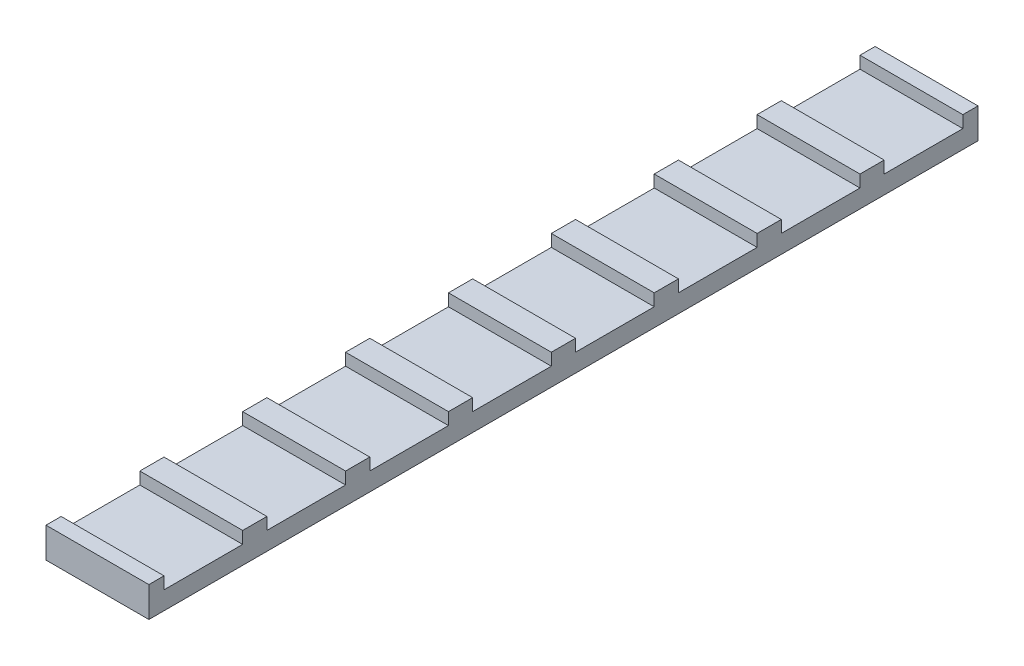
ISO-10303-21;
HEADER;
FILE_DESCRIPTION(('STEP AP214'),'2;1');
FILE_NAME('part.step','',(''),(''),'','','');
FILE_SCHEMA(('AUTOMOTIVE_DESIGN { 1 0 10303 214 1 1 1 1 }'));
ENDSEC;
DATA;
#1=APPLICATION_CONTEXT('core data for automotive mechanical design processes');
#2=APPLICATION_PROTOCOL_DEFINITION('international standard','automotive_design',2000,#1);
#3=PRODUCT_CONTEXT('',#1,'mechanical');
#4=PRODUCT('Part','Part','',(#3));
#5=PRODUCT_RELATED_PRODUCT_CATEGORY('part','',(#4));
#6=PRODUCT_DEFINITION_FORMATION('','',#4);
#7=PRODUCT_DEFINITION_CONTEXT('part definition',#1,'design');
#8=PRODUCT_DEFINITION('design','',#6,#7);
#9=PRODUCT_DEFINITION_SHAPE('','',#8);
#10=(LENGTH_UNIT() NAMED_UNIT(*) SI_UNIT(.MILLI.,.METRE.));
#11=(NAMED_UNIT(*) PLANE_ANGLE_UNIT() SI_UNIT($,.RADIAN.));
#12=(NAMED_UNIT(*) SI_UNIT($,.STERADIAN.) SOLID_ANGLE_UNIT());
#13=UNCERTAINTY_MEASURE_WITH_UNIT(LENGTH_MEASURE(1.E-05),#10,'distance_accuracy_value','');
#14=(GEOMETRIC_REPRESENTATION_CONTEXT(3) GLOBAL_UNCERTAINTY_ASSIGNED_CONTEXT((#13)) GLOBAL_UNIT_ASSIGNED_CONTEXT((#10,
#11,#12)) REPRESENTATION_CONTEXT('',''));
#15=CARTESIAN_POINT('',(0.,0.,0.));
#16=DIRECTION('',(0.,0.,1.));
#17=DIRECTION('',(1.,0.,0.));
#18=AXIS2_PLACEMENT_3D('',#15,#16,#17);
#19=CARTESIAN_POINT('',(0.,5.,0.));
#20=DIRECTION('',(0.,-1.,0.));
#21=DIRECTION('',(0.,0.,-1.));
#22=AXIS2_PLACEMENT_3D('',#19,#20,#21);
#23=PLANE('',#22);
#24=DIRECTION('',(0.,0.,1.));
#25=VECTOR('',#24,1.);
#26=CARTESIAN_POINT('',(-8.5,5.,68.5));
#27=LINE('',#26,#25);
#28=CARTESIAN_POINT('',(-8.5,5.,-53.));
#29=VERTEX_POINT('',#28);
#30=CARTESIAN_POINT('',(-8.5,5.,-49.));
#31=VERTEX_POINT('',#30);
#32=EDGE_CURVE('E572',#29,#31,#27,.T.);
#33=ORIENTED_EDGE('',*,*,#32,.T.);
#34=DIRECTION('',(-1.,0.,0.));
#35=VECTOR('',#34,1.);
#36=CARTESIAN_POINT('',(-8.5,5.,-49.));
#37=LINE('',#36,#35);
#38=CARTESIAN_POINT('',(8.5,5.,-49.));
#39=VERTEX_POINT('',#38);
#40=EDGE_CURVE('E294',#39,#31,#37,.T.);
#41=ORIENTED_EDGE('',*,*,#40,.F.);
#42=DIRECTION('',(0.,0.,-1.));
#43=VECTOR('',#42,1.);
#44=CARTESIAN_POINT('',(8.5,5.,68.5));
#45=LINE('',#44,#43);
#46=CARTESIAN_POINT('',(8.5,5.,-53.));
#47=VERTEX_POINT('',#46);
#48=EDGE_CURVE('E562',#39,#47,#45,.T.);
#49=ORIENTED_EDGE('',*,*,#48,.T.);
#50=DIRECTION('',(1.,0.,0.));
#51=VECTOR('',#50,1.);
#52=CARTESIAN_POINT('',(-8.49999999999999,5.,-53.));
#53=LINE('',#52,#51);
#54=EDGE_CURVE('E535',#29,#47,#53,.T.);
#55=ORIENTED_EDGE('',*,*,#54,.F.);
#56=EDGE_LOOP('',(#33,#41,#49,#55));
#57=FACE_BOUND('',#56,.T.);
#58=ADVANCED_FACE('F39',(#57),#23,.F.);
#59=CARTESIAN_POINT('',(8.5,5.,-32.));
#60=VERTEX_POINT('',#59);
#61=CARTESIAN_POINT('',(8.5,5.,-36.));
#62=VERTEX_POINT('',#61);
#63=EDGE_CURVE('E678',#60,#62,#45,.T.);
#64=ORIENTED_EDGE('',*,*,#63,.T.);
#65=DIRECTION('',(1.,0.,0.));
#66=VECTOR('',#65,1.);
#67=CARTESIAN_POINT('',(-8.49999999999999,5.,-36.));
#68=LINE('',#67,#66);
#69=CARTESIAN_POINT('',(-8.5,5.,-36.));
#70=VERTEX_POINT('',#69);
#71=EDGE_CURVE('E336',#70,#62,#68,.T.);
#72=ORIENTED_EDGE('',*,*,#71,.F.);
#73=CARTESIAN_POINT('',(-8.5,5.,-32.));
#74=VERTEX_POINT('',#73);
#75=EDGE_CURVE('E300',#70,#74,#27,.T.);
#76=ORIENTED_EDGE('',*,*,#75,.T.);
#77=DIRECTION('',(-1.,0.,0.));
#78=VECTOR('',#77,1.);
#79=CARTESIAN_POINT('',(-8.5,5.,-32.));
#80=LINE('',#79,#78);
#81=EDGE_CURVE('E315',#60,#74,#80,.T.);
#82=ORIENTED_EDGE('',*,*,#81,.F.);
#83=EDGE_LOOP('',(#64,#72,#76,#82));
#84=FACE_BOUND('',#83,.T.);
#85=ADVANCED_FACE('F779',(#84),#23,.F.);
#86=CARTESIAN_POINT('',(8.5,5.,-15.));
#87=VERTEX_POINT('',#86);
#88=CARTESIAN_POINT('',(8.5,5.,-19.));
#89=VERTEX_POINT('',#88);
#90=EDGE_CURVE('E682',#87,#89,#45,.T.);
#91=ORIENTED_EDGE('',*,*,#90,.T.);
#92=DIRECTION('',(1.,0.,0.));
#93=VECTOR('',#92,1.);
#94=CARTESIAN_POINT('',(-8.49999999999999,5.,-19.));
#95=LINE('',#94,#93);
#96=CARTESIAN_POINT('',(-8.5,5.,-19.));
#97=VERTEX_POINT('',#96);
#98=EDGE_CURVE('E327',#97,#89,#95,.T.);
#99=ORIENTED_EDGE('',*,*,#98,.F.);
#100=CARTESIAN_POINT('',(-8.5,5.,-15.));
#101=VERTEX_POINT('',#100);
#102=EDGE_CURVE('E642',#97,#101,#27,.T.);
#103=ORIENTED_EDGE('',*,*,#102,.T.);
#104=DIRECTION('',(-1.,0.,0.));
#105=VECTOR('',#104,1.);
#106=CARTESIAN_POINT('',(-8.5,5.,-15.));
#107=LINE('',#106,#105);
#108=EDGE_CURVE('E351',#87,#101,#107,.T.);
#109=ORIENTED_EDGE('',*,*,#108,.F.);
#110=EDGE_LOOP('',(#91,#99,#103,#109));
#111=FACE_BOUND('',#110,.T.);
#112=ADVANCED_FACE('F704',(#111),#23,.F.);
#113=CARTESIAN_POINT('',(8.5,5.,2.00000000000002));
#114=VERTEX_POINT('',#113);
#115=CARTESIAN_POINT('',(8.5,5.,-1.99999999999999));
#116=VERTEX_POINT('',#115);
#117=EDGE_CURVE('E696',#114,#116,#45,.T.);
#118=ORIENTED_EDGE('',*,*,#117,.T.);
#119=DIRECTION('',(1.,0.,0.));
#120=VECTOR('',#119,1.);
#121=CARTESIAN_POINT('',(-8.49999999999999,5.,-1.99999999999999));
#122=LINE('',#121,#120);
#123=CARTESIAN_POINT('',(-8.5,5.,-1.99999999999999));
#124=VERTEX_POINT('',#123);
#125=EDGE_CURVE('E363',#124,#116,#122,.T.);
#126=ORIENTED_EDGE('',*,*,#125,.F.);
#127=CARTESIAN_POINT('',(-8.5,5.,2.00000000000002));
#128=VERTEX_POINT('',#127);
#129=EDGE_CURVE('E635',#124,#128,#27,.T.);
#130=ORIENTED_EDGE('',*,*,#129,.T.);
#131=DIRECTION('',(-1.,0.,0.));
#132=VECTOR('',#131,1.);
#133=CARTESIAN_POINT('',(-8.5,5.,2.00000000000002));
#134=LINE('',#133,#132);
#135=EDGE_CURVE('E386',#114,#128,#134,.T.);
#136=ORIENTED_EDGE('',*,*,#135,.F.);
#137=EDGE_LOOP('',(#118,#126,#130,#136));
#138=FACE_BOUND('',#137,.T.);
#139=ADVANCED_FACE('F726',(#138),#23,.F.);
#140=CARTESIAN_POINT('',(8.5,5.,19.));
#141=VERTEX_POINT('',#140);
#142=CARTESIAN_POINT('',(8.5,5.,15.));
#143=VERTEX_POINT('',#142);
#144=EDGE_CURVE('E692',#141,#143,#45,.T.);
#145=ORIENTED_EDGE('',*,*,#144,.T.);
#146=DIRECTION('',(1.,0.,0.));
#147=VECTOR('',#146,1.);
#148=CARTESIAN_POINT('',(-8.49999999999999,5.,15.));
#149=LINE('',#148,#147);
#150=CARTESIAN_POINT('',(-8.5,5.,15.));
#151=VERTEX_POINT('',#150);
#152=EDGE_CURVE('E398',#151,#143,#149,.T.);
#153=ORIENTED_EDGE('',*,*,#152,.F.);
#154=CARTESIAN_POINT('',(-8.5,5.,19.));
#155=VERTEX_POINT('',#154);
#156=EDGE_CURVE('E628',#151,#155,#27,.T.);
#157=ORIENTED_EDGE('',*,*,#156,.T.);
#158=DIRECTION('',(-1.,0.,0.));
#159=VECTOR('',#158,1.);
#160=CARTESIAN_POINT('',(-8.5,5.,19.));
#161=LINE('',#160,#159);
#162=EDGE_CURVE('E421',#141,#155,#161,.T.);
#163=ORIENTED_EDGE('',*,*,#162,.F.);
#164=EDGE_LOOP('',(#145,#153,#157,#163));
#165=FACE_BOUND('',#164,.T.);
#166=ADVANCED_FACE('F738',(#165),#23,.F.);
#167=CARTESIAN_POINT('',(8.5,5.,36.));
#168=VERTEX_POINT('',#167);
#169=CARTESIAN_POINT('',(8.5,5.,32.));
#170=VERTEX_POINT('',#169);
#171=EDGE_CURVE('E688',#168,#170,#45,.T.);
#172=ORIENTED_EDGE('',*,*,#171,.T.);
#173=DIRECTION('',(1.,0.,0.));
#174=VECTOR('',#173,1.);
#175=CARTESIAN_POINT('',(-8.49999999999999,5.,32.));
#176=LINE('',#175,#174);
#177=CARTESIAN_POINT('',(-8.5,5.,32.));
#178=VERTEX_POINT('',#177);
#179=EDGE_CURVE('E433',#178,#170,#176,.T.);
#180=ORIENTED_EDGE('',*,*,#179,.F.);
#181=CARTESIAN_POINT('',(-8.5,5.,36.));
#182=VERTEX_POINT('',#181);
#183=EDGE_CURVE('E622',#178,#182,#27,.T.);
#184=ORIENTED_EDGE('',*,*,#183,.T.);
#185=DIRECTION('',(-1.,0.,0.));
#186=VECTOR('',#185,1.);
#187=CARTESIAN_POINT('',(-8.5,5.,36.));
#188=LINE('',#187,#186);
#189=EDGE_CURVE('E456',#168,#182,#188,.T.);
#190=ORIENTED_EDGE('',*,*,#189,.F.);
#191=EDGE_LOOP('',(#172,#180,#184,#190));
#192=FACE_BOUND('',#191,.T.);
#193=ADVANCED_FACE('F750',(#192),#23,.F.);
#194=CARTESIAN_POINT('',(8.5,5.,53.));
#195=VERTEX_POINT('',#194);
#196=CARTESIAN_POINT('',(8.5,5.,49.));
#197=VERTEX_POINT('',#196);
#198=EDGE_CURVE('E561',#195,#197,#45,.T.);
#199=ORIENTED_EDGE('',*,*,#198,.T.);
#200=DIRECTION('',(1.,0.,0.));
#201=VECTOR('',#200,1.);
#202=CARTESIAN_POINT('',(-8.49999999999999,5.,49.));
#203=LINE('',#202,#201);
#204=CARTESIAN_POINT('',(-8.5,5.,49.));
#205=VERTEX_POINT('',#204);
#206=EDGE_CURVE('E467',#205,#197,#203,.T.);
#207=ORIENTED_EDGE('',*,*,#206,.F.);
#208=CARTESIAN_POINT('',(-8.5,5.,53.));
#209=VERTEX_POINT('',#208);
#210=EDGE_CURVE('E619',#205,#209,#27,.T.);
#211=ORIENTED_EDGE('',*,*,#210,.T.);
#212=DIRECTION('',(-1.,0.,0.));
#213=VECTOR('',#212,1.);
#214=CARTESIAN_POINT('',(-8.5,5.,53.));
#215=LINE('',#214,#213);
#216=EDGE_CURVE('E490',#195,#209,#215,.T.);
#217=ORIENTED_EDGE('',*,*,#216,.F.);
#218=EDGE_LOOP('',(#199,#207,#211,#217));
#219=FACE_BOUND('',#218,.T.);
#220=ADVANCED_FACE('F760',(#219),#23,.F.);
#221=CARTESIAN_POINT('',(-8.5,5.,-68.5));
#222=VERTEX_POINT('',#221);
#223=CARTESIAN_POINT('',(-8.5,5.,-66.));
#224=VERTEX_POINT('',#223);
#225=EDGE_CURVE('E567',#222,#224,#27,.T.);
#226=ORIENTED_EDGE('',*,*,#225,.T.);
#227=DIRECTION('',(-1.,0.,0.));
#228=VECTOR('',#227,1.);
#229=CARTESIAN_POINT('',(-8.5,5.,-66.));
#230=LINE('',#229,#228);
#231=CARTESIAN_POINT('',(8.5,5.,-66.));
#232=VERTEX_POINT('',#231);
#233=EDGE_CURVE('E523',#232,#224,#230,.T.);
#234=ORIENTED_EDGE('',*,*,#233,.F.);
#235=CARTESIAN_POINT('',(8.5,5.,-68.5));
#236=VERTEX_POINT('',#235);
#237=EDGE_CURVE('E563',#232,#236,#45,.T.);
#238=ORIENTED_EDGE('',*,*,#237,.T.);
#239=DIRECTION('',(-1.,0.,0.));
#240=VECTOR('',#239,1.);
#241=CARTESIAN_POINT('',(-8.5,5.,-68.5));
#242=LINE('',#241,#240);
#243=EDGE_CURVE('E560',#236,#222,#242,.T.);
#244=ORIENTED_EDGE('',*,*,#243,.T.);
#245=EDGE_LOOP('',(#226,#234,#238,#244));
#246=FACE_BOUND('',#245,.T.);
#247=ADVANCED_FACE('F787',(#246),#23,.F.);
#248=CARTESIAN_POINT('',(8.5,5.,68.5));
#249=DIRECTION('',(-1.,0.,0.));
#250=DIRECTION('',(0.,0.,1.));
#251=AXIS2_PLACEMENT_3D('',#248,#249,#250);
#252=PLANE('',#251);
#253=ORIENTED_EDGE('',*,*,#48,.F.);
#254=DIRECTION('',(0.,1.,0.));
#255=VECTOR('',#254,1.);
#256=CARTESIAN_POINT('',(8.5,3.,-49.));
#257=LINE('',#256,#255);
#258=CARTESIAN_POINT('',(8.5,3.,-49.));
#259=VERTEX_POINT('',#258);
#260=EDGE_CURVE('E305',#259,#39,#257,.T.);
#261=ORIENTED_EDGE('',*,*,#260,.F.);
#262=DIRECTION('',(0.,0.,-1.));
#263=VECTOR('',#262,1.);
#264=CARTESIAN_POINT('',(8.5,3.,-49.));
#265=LINE('',#264,#263);
#266=CARTESIAN_POINT('',(8.5,3.,-36.));
#267=VERTEX_POINT('',#266);
#268=EDGE_CURVE('E283',#267,#259,#265,.T.);
#269=ORIENTED_EDGE('',*,*,#268,.F.);
#270=DIRECTION('',(0.,1.,0.));
#271=VECTOR('',#270,1.);
#272=CARTESIAN_POINT('',(8.5,3.,-36.));
#273=LINE('',#272,#271);
#274=EDGE_CURVE('E279',#267,#62,#273,.T.);
#275=ORIENTED_EDGE('',*,*,#274,.T.);
#276=ORIENTED_EDGE('',*,*,#63,.F.);
#277=DIRECTION('',(0.,1.,0.));
#278=VECTOR('',#277,1.);
#279=CARTESIAN_POINT('',(8.5,3.,-32.));
#280=LINE('',#279,#278);
#281=CARTESIAN_POINT('',(8.5,3.,-32.));
#282=VERTEX_POINT('',#281);
#283=EDGE_CURVE('E337',#282,#60,#280,.T.);
#284=ORIENTED_EDGE('',*,*,#283,.F.);
#285=DIRECTION('',(0.,0.,-1.));
#286=VECTOR('',#285,1.);
#287=CARTESIAN_POINT('',(8.5,3.,-32.));
#288=LINE('',#287,#286);
#289=CARTESIAN_POINT('',(8.5,3.,-19.));
#290=VERTEX_POINT('',#289);
#291=EDGE_CURVE('E319',#290,#282,#288,.T.);
#292=ORIENTED_EDGE('',*,*,#291,.F.);
#293=DIRECTION('',(0.,1.,0.));
#294=VECTOR('',#293,1.);
#295=CARTESIAN_POINT('',(8.5,3.,-19.));
#296=LINE('',#295,#294);
#297=EDGE_CURVE('E340',#290,#89,#296,.T.);
#298=ORIENTED_EDGE('',*,*,#297,.T.);
#299=ORIENTED_EDGE('',*,*,#90,.F.);
#300=DIRECTION('',(0.,1.,0.));
#301=VECTOR('',#300,1.);
#302=CARTESIAN_POINT('',(8.5,3.,-15.));
#303=LINE('',#302,#301);
#304=CARTESIAN_POINT('',(8.5,3.,-15.));
#305=VERTEX_POINT('',#304);
#306=EDGE_CURVE('E372',#305,#87,#303,.T.);
#307=ORIENTED_EDGE('',*,*,#306,.F.);
#308=DIRECTION('',(0.,0.,-1.));
#309=VECTOR('',#308,1.);
#310=CARTESIAN_POINT('',(8.5,3.,-15.));
#311=LINE('',#310,#309);
#312=CARTESIAN_POINT('',(8.5,3.,-1.99999999999999));
#313=VERTEX_POINT('',#312);
#314=EDGE_CURVE('E355',#313,#305,#311,.T.);
#315=ORIENTED_EDGE('',*,*,#314,.F.);
#316=DIRECTION('',(0.,1.,0.));
#317=VECTOR('',#316,1.);
#318=CARTESIAN_POINT('',(8.5,3.,-1.99999999999999));
#319=LINE('',#318,#317);
#320=EDGE_CURVE('E375',#313,#116,#319,.T.);
#321=ORIENTED_EDGE('',*,*,#320,.T.);
#322=ORIENTED_EDGE('',*,*,#117,.F.);
#323=DIRECTION('',(0.,1.,0.));
#324=VECTOR('',#323,1.);
#325=CARTESIAN_POINT('',(8.5,3.,2.00000000000002));
#326=LINE('',#325,#324);
#327=CARTESIAN_POINT('',(8.5,3.,2.00000000000002));
#328=VERTEX_POINT('',#327);
#329=EDGE_CURVE('E407',#328,#114,#326,.T.);
#330=ORIENTED_EDGE('',*,*,#329,.F.);
#331=DIRECTION('',(0.,0.,-1.));
#332=VECTOR('',#331,1.);
#333=CARTESIAN_POINT('',(8.5,3.,2.00000000000002));
#334=LINE('',#333,#332);
#335=CARTESIAN_POINT('',(8.5,3.,15.));
#336=VERTEX_POINT('',#335);
#337=EDGE_CURVE('E390',#336,#328,#334,.T.);
#338=ORIENTED_EDGE('',*,*,#337,.F.);
#339=DIRECTION('',(0.,1.,0.));
#340=VECTOR('',#339,1.);
#341=CARTESIAN_POINT('',(8.5,3.,15.));
#342=LINE('',#341,#340);
#343=EDGE_CURVE('E410',#336,#143,#342,.T.);
#344=ORIENTED_EDGE('',*,*,#343,.T.);
#345=ORIENTED_EDGE('',*,*,#144,.F.);
#346=DIRECTION('',(0.,1.,0.));
#347=VECTOR('',#346,1.);
#348=CARTESIAN_POINT('',(8.5,3.,19.));
#349=LINE('',#348,#347);
#350=CARTESIAN_POINT('',(8.5,3.,19.));
#351=VERTEX_POINT('',#350);
#352=EDGE_CURVE('E442',#351,#141,#349,.T.);
#353=ORIENTED_EDGE('',*,*,#352,.F.);
#354=DIRECTION('',(0.,0.,-1.));
#355=VECTOR('',#354,1.);
#356=CARTESIAN_POINT('',(8.5,3.,19.));
#357=LINE('',#356,#355);
#358=CARTESIAN_POINT('',(8.5,3.,32.));
#359=VERTEX_POINT('',#358);
#360=EDGE_CURVE('E425',#359,#351,#357,.T.);
#361=ORIENTED_EDGE('',*,*,#360,.F.);
#362=DIRECTION('',(0.,1.,0.));
#363=VECTOR('',#362,1.);
#364=CARTESIAN_POINT('',(8.5,3.,32.));
#365=LINE('',#364,#363);
#366=EDGE_CURVE('E445',#359,#170,#365,.T.);
#367=ORIENTED_EDGE('',*,*,#366,.T.);
#368=ORIENTED_EDGE('',*,*,#171,.F.);
#369=DIRECTION('',(0.,1.,0.));
#370=VECTOR('',#369,1.);
#371=CARTESIAN_POINT('',(8.5,3.,36.));
#372=LINE('',#371,#370);
#373=CARTESIAN_POINT('',(8.5,3.,36.));
#374=VERTEX_POINT('',#373);
#375=EDGE_CURVE('E476',#374,#168,#372,.T.);
#376=ORIENTED_EDGE('',*,*,#375,.F.);
#377=DIRECTION('',(0.,0.,-1.));
#378=VECTOR('',#377,1.);
#379=CARTESIAN_POINT('',(8.5,3.,36.));
#380=LINE('',#379,#378);
#381=CARTESIAN_POINT('',(8.5,3.,49.));
#382=VERTEX_POINT('',#381);
#383=EDGE_CURVE('E460',#382,#374,#380,.T.);
#384=ORIENTED_EDGE('',*,*,#383,.F.);
#385=DIRECTION('',(0.,1.,0.));
#386=VECTOR('',#385,1.);
#387=CARTESIAN_POINT('',(8.5,3.,49.));
#388=LINE('',#387,#386);
#389=EDGE_CURVE('E479',#382,#197,#388,.T.);
#390=ORIENTED_EDGE('',*,*,#389,.T.);
#391=ORIENTED_EDGE('',*,*,#198,.F.);
#392=DIRECTION('',(0.,1.,0.));
#393=VECTOR('',#392,1.);
#394=CARTESIAN_POINT('',(8.5,3.,53.));
#395=LINE('',#394,#393);
#396=CARTESIAN_POINT('',(8.5,3.,53.));
#397=VERTEX_POINT('',#396);
#398=EDGE_CURVE('E509',#397,#195,#395,.T.);
#399=ORIENTED_EDGE('',*,*,#398,.F.);
#400=DIRECTION('',(0.,0.,-1.));
#401=VECTOR('',#400,1.);
#402=CARTESIAN_POINT('',(8.5,3.,53.));
#403=LINE('',#402,#401);
#404=CARTESIAN_POINT('',(8.5,3.,66.));
#405=VERTEX_POINT('',#404);
#406=EDGE_CURVE('E494',#405,#397,#403,.T.);
#407=ORIENTED_EDGE('',*,*,#406,.F.);
#408=DIRECTION('',(0.,1.,0.));
#409=VECTOR('',#408,1.);
#410=CARTESIAN_POINT('',(8.5,3.,66.));
#411=LINE('',#410,#409);
#412=CARTESIAN_POINT('',(8.5,5.,66.));
#413=VERTEX_POINT('',#412);
#414=EDGE_CURVE('E512',#405,#413,#411,.T.);
#415=ORIENTED_EDGE('',*,*,#414,.T.);
#416=CARTESIAN_POINT('',(8.5,5.,68.5));
#417=VERTEX_POINT('',#416);
#418=EDGE_CURVE('E556',#417,#413,#45,.T.);
#419=ORIENTED_EDGE('',*,*,#418,.F.);
#420=DIRECTION('',(0.,-1.,0.));
#421=VECTOR('',#420,1.);
#422=CARTESIAN_POINT('',(8.5,5.,68.5));
#423=LINE('',#422,#421);
#424=CARTESIAN_POINT('',(8.5,0.,68.5));
#425=VERTEX_POINT('',#424);
#426=EDGE_CURVE('E575',#417,#425,#423,.T.);
#427=ORIENTED_EDGE('',*,*,#426,.T.);
#428=DIRECTION('',(0.,0.,-1.));
#429=VECTOR('',#428,1.);
#430=CARTESIAN_POINT('',(8.5,0.,68.5));
#431=LINE('',#430,#429);
#432=CARTESIAN_POINT('',(8.5,0.,-68.5));
#433=VERTEX_POINT('',#432);
#434=EDGE_CURVE('E546',#425,#433,#431,.T.);
#435=ORIENTED_EDGE('',*,*,#434,.T.);
#436=DIRECTION('',(0.,-1.,0.));
#437=VECTOR('',#436,1.);
#438=CARTESIAN_POINT('',(8.5,5.,-68.5));
#439=LINE('',#438,#437);
#440=EDGE_CURVE('E11',#236,#433,#439,.T.);
#441=ORIENTED_EDGE('',*,*,#440,.F.);
#442=ORIENTED_EDGE('',*,*,#237,.F.);
#443=DIRECTION('',(0.,1.,0.));
#444=VECTOR('',#443,1.);
#445=CARTESIAN_POINT('',(8.5,3.,-66.));
#446=LINE('',#445,#444);
#447=CARTESIAN_POINT('',(8.5,3.,-66.));
#448=VERTEX_POINT('',#447);
#449=EDGE_CURVE('E547',#448,#232,#446,.T.);
#450=ORIENTED_EDGE('',*,*,#449,.F.);
#451=DIRECTION('',(0.,0.,-1.));
#452=VECTOR('',#451,1.);
#453=CARTESIAN_POINT('',(8.5,3.,-66.));
#454=LINE('',#453,#452);
#455=CARTESIAN_POINT('',(8.5,3.,-53.));
#456=VERTEX_POINT('',#455);
#457=EDGE_CURVE('E527',#456,#448,#454,.T.);
#458=ORIENTED_EDGE('',*,*,#457,.F.);
#459=DIRECTION('',(0.,1.,0.));
#460=VECTOR('',#459,1.);
#461=CARTESIAN_POINT('',(8.5,3.,-53.));
#462=LINE('',#461,#460);
#463=EDGE_CURVE('E550',#456,#47,#462,.T.);
#464=ORIENTED_EDGE('',*,*,#463,.T.);
#465=EDGE_LOOP('',(#253,#261,#269,#275,#276,#284,#292,#298,#299,#307,#315,#321,#322,#330,#338,
#344,#345,#353,#361,#367,#368,#376,#384,#390,#391,#399,#407,#415,#419,#427,#435,#441,#442,#450,
#458,#464));
#466=FACE_BOUND('',#465,.T.);
#467=ADVANCED_FACE('F41',(#466),#252,.F.);
#468=CARTESIAN_POINT('',(-8.5,5.,-68.5));
#469=DIRECTION('',(0.,0.,1.));
#470=DIRECTION('',(1.,0.,0.));
#471=AXIS2_PLACEMENT_3D('',#468,#469,#470);
#472=PLANE('',#471);
#473=DIRECTION('',(-1.,0.,0.));
#474=VECTOR('',#473,1.);
#475=CARTESIAN_POINT('',(-8.5,0.,-68.5));
#476=LINE('',#475,#474);
#477=CARTESIAN_POINT('',(-8.5,0.,-68.5));
#478=VERTEX_POINT('',#477);
#479=EDGE_CURVE('E579',#433,#478,#476,.T.);
#480=ORIENTED_EDGE('',*,*,#479,.T.);
#481=DIRECTION('',(0.,-1.,0.));
#482=VECTOR('',#481,1.);
#483=CARTESIAN_POINT('',(-8.5,5.,-68.5));
#484=LINE('',#483,#482);
#485=EDGE_CURVE('E48',#222,#478,#484,.T.);
#486=ORIENTED_EDGE('',*,*,#485,.F.);
#487=ORIENTED_EDGE('',*,*,#243,.F.);
#488=ORIENTED_EDGE('',*,*,#440,.T.);
#489=EDGE_LOOP('',(#480,#486,#487,#488));
#490=FACE_BOUND('',#489,.T.);
#491=ADVANCED_FACE('F799',(#490),#472,.F.);
#492=CARTESIAN_POINT('',(-8.5,5.,68.5));
#493=DIRECTION('',(1.,0.,0.));
#494=DIRECTION('',(0.,0.,-1.));
#495=AXIS2_PLACEMENT_3D('',#492,#493,#494);
#496=PLANE('',#495);
#497=DIRECTION('',(0.,0.,1.));
#498=VECTOR('',#497,1.);
#499=CARTESIAN_POINT('',(-8.5,3.,-49.));
#500=LINE('',#499,#498);
#501=CARTESIAN_POINT('',(-8.5,3.,-49.));
#502=VERTEX_POINT('',#501);
#503=CARTESIAN_POINT('',(-8.49999999999999,3.,-36.));
#504=VERTEX_POINT('',#503);
#505=EDGE_CURVE('E284',#502,#504,#500,.T.);
#506=ORIENTED_EDGE('',*,*,#505,.F.);
#507=DIRECTION('',(0.,1.,0.));
#508=VECTOR('',#507,1.);
#509=CARTESIAN_POINT('',(-8.5,3.,-49.));
#510=LINE('',#509,#508);
#511=EDGE_CURVE('E539',#502,#31,#510,.T.);
#512=ORIENTED_EDGE('',*,*,#511,.T.);
#513=ORIENTED_EDGE('',*,*,#32,.F.);
#514=DIRECTION('',(0.,1.,0.));
#515=VECTOR('',#514,1.);
#516=CARTESIAN_POINT('',(-8.49999999999999,3.,-53.));
#517=LINE('',#516,#515);
#518=CARTESIAN_POINT('',(-8.49999999999999,3.,-53.));
#519=VERTEX_POINT('',#518);
#520=EDGE_CURVE('E534',#519,#29,#517,.T.);
#521=ORIENTED_EDGE('',*,*,#520,.F.);
#522=DIRECTION('',(0.,0.,1.));
#523=VECTOR('',#522,1.);
#524=CARTESIAN_POINT('',(-8.5,3.,-66.));
#525=LINE('',#524,#523);
#526=CARTESIAN_POINT('',(-8.5,3.,-66.));
#527=VERTEX_POINT('',#526);
#528=EDGE_CURVE('E518',#527,#519,#525,.T.);
#529=ORIENTED_EDGE('',*,*,#528,.F.);
#530=DIRECTION('',(0.,1.,0.));
#531=VECTOR('',#530,1.);
#532=CARTESIAN_POINT('',(-8.5,3.,-66.));
#533=LINE('',#532,#531);
#534=EDGE_CURVE('E542',#527,#224,#533,.T.);
#535=ORIENTED_EDGE('',*,*,#534,.T.);
#536=ORIENTED_EDGE('',*,*,#225,.F.);
#537=ORIENTED_EDGE('',*,*,#485,.T.);
#538=DIRECTION('',(0.,0.,1.));
#539=VECTOR('',#538,1.);
#540=CARTESIAN_POINT('',(-8.5,0.,68.5));
#541=LINE('',#540,#539);
#542=CARTESIAN_POINT('',(-8.5,0.,68.5));
#543=VERTEX_POINT('',#542);
#544=EDGE_CURVE('E582',#478,#543,#541,.T.);
#545=ORIENTED_EDGE('',*,*,#544,.T.);
#546=DIRECTION('',(0.,-1.,0.));
#547=VECTOR('',#546,1.);
#548=CARTESIAN_POINT('',(-8.5,5.,68.5));
#549=LINE('',#548,#547);
#550=CARTESIAN_POINT('',(-8.5,5.,68.5));
#551=VERTEX_POINT('',#550);
#552=EDGE_CURVE('E591',#551,#543,#549,.T.);
#553=ORIENTED_EDGE('',*,*,#552,.F.);
#554=CARTESIAN_POINT('',(-8.5,5.,66.));
#555=VERTEX_POINT('',#554);
#556=EDGE_CURVE('E566',#555,#551,#27,.T.);
#557=ORIENTED_EDGE('',*,*,#556,.F.);
#558=DIRECTION('',(0.,1.,0.));
#559=VECTOR('',#558,1.);
#560=CARTESIAN_POINT('',(-8.49999999999999,3.,66.));
#561=LINE('',#560,#559);
#562=CARTESIAN_POINT('',(-8.49999999999999,3.,66.));
#563=VERTEX_POINT('',#562);
#564=EDGE_CURVE('E55',#563,#555,#561,.T.);
#565=ORIENTED_EDGE('',*,*,#564,.F.);
#566=DIRECTION('',(0.,0.,1.));
#567=VECTOR('',#566,1.);
#568=CARTESIAN_POINT('',(-8.5,3.,53.));
#569=LINE('',#568,#567);
#570=CARTESIAN_POINT('',(-8.5,3.,53.));
#571=VERTEX_POINT('',#570);
#572=EDGE_CURVE('E485',#571,#563,#569,.T.);
#573=ORIENTED_EDGE('',*,*,#572,.F.);
#574=DIRECTION('',(0.,1.,0.));
#575=VECTOR('',#574,1.);
#576=CARTESIAN_POINT('',(-8.5,3.,53.));
#577=LINE('',#576,#575);
#578=EDGE_CURVE('E470',#571,#209,#577,.T.);
#579=ORIENTED_EDGE('',*,*,#578,.T.);
#580=ORIENTED_EDGE('',*,*,#210,.F.);
#581=DIRECTION('',(0.,1.,0.));
#582=VECTOR('',#581,1.);
#583=CARTESIAN_POINT('',(-8.49999999999999,3.,49.));
#584=LINE('',#583,#582);
#585=CARTESIAN_POINT('',(-8.49999999999999,3.,49.));
#586=VERTEX_POINT('',#585);
#587=EDGE_CURVE('E63',#586,#205,#584,.T.);
#588=ORIENTED_EDGE('',*,*,#587,.F.);
#589=DIRECTION('',(0.,0.,1.));
#590=VECTOR('',#589,1.);
#591=CARTESIAN_POINT('',(-8.5,3.,36.));
#592=LINE('',#591,#590);
#593=CARTESIAN_POINT('',(-8.5,3.,36.));
#594=VERTEX_POINT('',#593);
#595=EDGE_CURVE('E451',#594,#586,#592,.T.);
#596=ORIENTED_EDGE('',*,*,#595,.F.);
#597=DIRECTION('',(0.,1.,0.));
#598=VECTOR('',#597,1.);
#599=CARTESIAN_POINT('',(-8.5,3.,36.));
#600=LINE('',#599,#598);
#601=EDGE_CURVE('E436',#594,#182,#600,.T.);
#602=ORIENTED_EDGE('',*,*,#601,.T.);
#603=ORIENTED_EDGE('',*,*,#183,.F.);
#604=DIRECTION('',(0.,1.,0.));
#605=VECTOR('',#604,1.);
#606=CARTESIAN_POINT('',(-8.49999999999999,3.,32.));
#607=LINE('',#606,#605);
#608=CARTESIAN_POINT('',(-8.49999999999999,3.,32.));
#609=VERTEX_POINT('',#608);
#610=EDGE_CURVE('E432',#609,#178,#607,.T.);
#611=ORIENTED_EDGE('',*,*,#610,.F.);
#612=DIRECTION('',(0.,0.,1.));
#613=VECTOR('',#612,1.);
#614=CARTESIAN_POINT('',(-8.5,3.,19.));
#615=LINE('',#614,#613);
#616=CARTESIAN_POINT('',(-8.5,3.,19.));
#617=VERTEX_POINT('',#616);
#618=EDGE_CURVE('E416',#617,#609,#615,.T.);
#619=ORIENTED_EDGE('',*,*,#618,.F.);
#620=DIRECTION('',(0.,1.,0.));
#621=VECTOR('',#620,1.);
#622=CARTESIAN_POINT('',(-8.5,3.,19.));
#623=LINE('',#622,#621);
#624=EDGE_CURVE('E401',#617,#155,#623,.T.);
#625=ORIENTED_EDGE('',*,*,#624,.T.);
#626=ORIENTED_EDGE('',*,*,#156,.F.);
#627=DIRECTION('',(0.,1.,0.));
#628=VECTOR('',#627,1.);
#629=CARTESIAN_POINT('',(-8.49999999999999,3.,15.));
#630=LINE('',#629,#628);
#631=CARTESIAN_POINT('',(-8.49999999999999,3.,15.));
#632=VERTEX_POINT('',#631);
#633=EDGE_CURVE('E397',#632,#151,#630,.T.);
#634=ORIENTED_EDGE('',*,*,#633,.F.);
#635=DIRECTION('',(0.,0.,1.));
#636=VECTOR('',#635,1.);
#637=CARTESIAN_POINT('',(-8.5,3.,2.00000000000002));
#638=LINE('',#637,#636);
#639=CARTESIAN_POINT('',(-8.5,3.,2.00000000000002));
#640=VERTEX_POINT('',#639);
#641=EDGE_CURVE('E381',#640,#632,#638,.T.);
#642=ORIENTED_EDGE('',*,*,#641,.F.);
#643=DIRECTION('',(0.,1.,0.));
#644=VECTOR('',#643,1.);
#645=CARTESIAN_POINT('',(-8.5,3.,2.00000000000002));
#646=LINE('',#645,#644);
#647=EDGE_CURVE('E366',#640,#128,#646,.T.);
#648=ORIENTED_EDGE('',*,*,#647,.T.);
#649=ORIENTED_EDGE('',*,*,#129,.F.);
#650=DIRECTION('',(0.,1.,0.));
#651=VECTOR('',#650,1.);
#652=CARTESIAN_POINT('',(-8.49999999999999,3.,-1.99999999999999));
#653=LINE('',#652,#651);
#654=CARTESIAN_POINT('',(-8.49999999999999,3.,-1.99999999999999));
#655=VERTEX_POINT('',#654);
#656=EDGE_CURVE('E362',#655,#124,#653,.T.);
#657=ORIENTED_EDGE('',*,*,#656,.F.);
#658=DIRECTION('',(0.,0.,1.));
#659=VECTOR('',#658,1.);
#660=CARTESIAN_POINT('',(-8.5,3.,-15.));
#661=LINE('',#660,#659);
#662=CARTESIAN_POINT('',(-8.5,3.,-15.));
#663=VERTEX_POINT('',#662);
#664=EDGE_CURVE('E346',#663,#655,#661,.T.);
#665=ORIENTED_EDGE('',*,*,#664,.F.);
#666=DIRECTION('',(0.,1.,0.));
#667=VECTOR('',#666,1.);
#668=CARTESIAN_POINT('',(-8.5,3.,-15.));
#669=LINE('',#668,#667);
#670=EDGE_CURVE('E330',#663,#101,#669,.T.);
#671=ORIENTED_EDGE('',*,*,#670,.T.);
#672=ORIENTED_EDGE('',*,*,#102,.F.);
#673=DIRECTION('',(0.,1.,0.));
#674=VECTOR('',#673,1.);
#675=CARTESIAN_POINT('',(-8.49999999999999,3.,-19.));
#676=LINE('',#675,#674);
#677=CARTESIAN_POINT('',(-8.49999999999999,3.,-19.));
#678=VERTEX_POINT('',#677);
#679=EDGE_CURVE('E326',#678,#97,#676,.T.);
#680=ORIENTED_EDGE('',*,*,#679,.F.);
#681=DIRECTION('',(0.,0.,1.));
#682=VECTOR('',#681,1.);
#683=CARTESIAN_POINT('',(-8.5,3.,-32.));
#684=LINE('',#683,#682);
#685=CARTESIAN_POINT('',(-8.5,3.,-32.));
#686=VERTEX_POINT('',#685);
#687=EDGE_CURVE('E310',#686,#678,#684,.T.);
#688=ORIENTED_EDGE('',*,*,#687,.F.);
#689=DIRECTION('',(0.,1.,0.));
#690=VECTOR('',#689,1.);
#691=CARTESIAN_POINT('',(-8.5,3.,-32.));
#692=LINE('',#691,#690);
#693=EDGE_CURVE('E333',#686,#74,#692,.T.);
#694=ORIENTED_EDGE('',*,*,#693,.T.);
#695=ORIENTED_EDGE('',*,*,#75,.F.);
#696=DIRECTION('',(0.,1.,0.));
#697=VECTOR('',#696,1.);
#698=CARTESIAN_POINT('',(-8.49999999999999,3.,-36.));
#699=LINE('',#698,#697);
#700=EDGE_CURVE('E276',#504,#70,#699,.T.);
#701=ORIENTED_EDGE('',*,*,#700,.F.);
#702=EDGE_LOOP('',(#506,#512,#513,#521,#529,#535,#536,#537,#545,#553,#557,#565,#573,#579,#580,
#588,#596,#602,#603,#611,#619,#625,#626,#634,#642,#648,#649,#657,#665,#671,#672,#680,#688,#694,
#695,#701));
#703=FACE_BOUND('',#702,.T.);
#704=ADVANCED_FACE('F297',(#703),#496,.F.);
#705=CARTESIAN_POINT('',(-8.5,5.,68.5));
#706=DIRECTION('',(0.,0.,-1.));
#707=DIRECTION('',(-1.,0.,0.));
#708=AXIS2_PLACEMENT_3D('',#705,#706,#707);
#709=PLANE('',#708);
#710=DIRECTION('',(1.,0.,0.));
#711=VECTOR('',#710,1.);
#712=CARTESIAN_POINT('',(-8.5,0.,68.5));
#713=LINE('',#712,#711);
#714=EDGE_CURVE('E585',#543,#425,#713,.T.);
#715=ORIENTED_EDGE('',*,*,#714,.T.);
#716=ORIENTED_EDGE('',*,*,#426,.F.);
#717=DIRECTION('',(1.,0.,0.));
#718=VECTOR('',#717,1.);
#719=CARTESIAN_POINT('',(-8.5,5.,68.5));
#720=LINE('',#719,#718);
#721=EDGE_CURVE('E571',#551,#417,#720,.T.);
#722=ORIENTED_EDGE('',*,*,#721,.F.);
#723=ORIENTED_EDGE('',*,*,#552,.T.);
#724=EDGE_LOOP('',(#715,#716,#722,#723));
#725=FACE_BOUND('',#724,.T.);
#726=ADVANCED_FACE('F608',(#725),#709,.F.);
#727=ORIENTED_EDGE('',*,*,#418,.T.);
#728=DIRECTION('',(1.,0.,0.));
#729=VECTOR('',#728,1.);
#730=CARTESIAN_POINT('',(-8.49999999999999,5.,66.));
#731=LINE('',#730,#729);
#732=EDGE_CURVE('E501',#555,#413,#731,.T.);
#733=ORIENTED_EDGE('',*,*,#732,.F.);
#734=ORIENTED_EDGE('',*,*,#556,.T.);
#735=ORIENTED_EDGE('',*,*,#721,.T.);
#736=EDGE_LOOP('',(#727,#733,#734,#735));
#737=FACE_BOUND('',#736,.T.);
#738=ADVANCED_FACE('F616',(#737),#23,.F.);
#739=CARTESIAN_POINT('',(0.,0.,0.));
#740=DIRECTION('',(0.,-1.,0.));
#741=DIRECTION('',(0.,0.,-1.));
#742=AXIS2_PLACEMENT_3D('',#739,#740,#741);
#743=PLANE('',#742);
#744=ORIENTED_EDGE('',*,*,#434,.F.);
#745=ORIENTED_EDGE('',*,*,#714,.F.);
#746=ORIENTED_EDGE('',*,*,#544,.F.);
#747=ORIENTED_EDGE('',*,*,#479,.F.);
#748=EDGE_LOOP('',(#744,#745,#746,#747));
#749=FACE_BOUND('',#748,.T.);
#750=ADVANCED_FACE('F605',(#749),#743,.T.);
#751=CARTESIAN_POINT('',(-8.5,3.,-66.));
#752=DIRECTION('',(0.,0.,-1.));
#753=DIRECTION('',(-1.,0.,0.));
#754=AXIS2_PLACEMENT_3D('',#751,#752,#753);
#755=PLANE('',#754);
#756=ORIENTED_EDGE('',*,*,#233,.T.);
#757=ORIENTED_EDGE('',*,*,#534,.F.);
#758=DIRECTION('',(-1.,0.,0.));
#759=VECTOR('',#758,1.);
#760=CARTESIAN_POINT('',(-8.5,3.,-66.));
#761=LINE('',#760,#759);
#762=EDGE_CURVE('E530',#448,#527,#761,.T.);
#763=ORIENTED_EDGE('',*,*,#762,.F.);
#764=ORIENTED_EDGE('',*,*,#449,.T.);
#765=EDGE_LOOP('',(#756,#757,#763,#764));
#766=FACE_BOUND('',#765,.T.);
#767=ADVANCED_FACE('F792',(#766),#755,.F.);
#768=CARTESIAN_POINT('',(-8.49999999999999,3.,-53.));
#769=DIRECTION('',(0.,0.,1.));
#770=DIRECTION('',(1.,0.,0.));
#771=AXIS2_PLACEMENT_3D('',#768,#769,#770);
#772=PLANE('',#771);
#773=ORIENTED_EDGE('',*,*,#54,.T.);
#774=ORIENTED_EDGE('',*,*,#463,.F.);
#775=DIRECTION('',(1.,0.,0.));
#776=VECTOR('',#775,1.);
#777=CARTESIAN_POINT('',(-8.49999999999999,3.,-53.));
#778=LINE('',#777,#776);
#779=EDGE_CURVE('E522',#519,#456,#778,.T.);
#780=ORIENTED_EDGE('',*,*,#779,.F.);
#781=ORIENTED_EDGE('',*,*,#520,.T.);
#782=EDGE_LOOP('',(#773,#774,#780,#781));
#783=FACE_BOUND('',#782,.T.);
#784=ADVANCED_FACE('F805',(#783),#772,.F.);
#785=CARTESIAN_POINT('',(0.,3.,0.));
#786=DIRECTION('',(0.,1.,0.));
#787=DIRECTION('',(0.,0.,1.));
#788=AXIS2_PLACEMENT_3D('',#785,#786,#787);
#789=PLANE('',#788);
#790=ORIENTED_EDGE('',*,*,#528,.T.);
#791=ORIENTED_EDGE('',*,*,#779,.T.);
#792=ORIENTED_EDGE('',*,*,#457,.T.);
#793=ORIENTED_EDGE('',*,*,#762,.T.);
#794=EDGE_LOOP('',(#790,#791,#792,#793));
#795=FACE_BOUND('',#794,.T.);
#796=ADVANCED_FACE('F775',(#795),#789,.T.);
#797=CARTESIAN_POINT('',(-8.5,3.,53.));
#798=DIRECTION('',(0.,0.,-1.));
#799=DIRECTION('',(-1.,0.,0.));
#800=AXIS2_PLACEMENT_3D('',#797,#798,#799);
#801=PLANE('',#800);
#802=ORIENTED_EDGE('',*,*,#216,.T.);
#803=ORIENTED_EDGE('',*,*,#578,.F.);
#804=DIRECTION('',(-1.,0.,0.));
#805=VECTOR('',#804,1.);
#806=CARTESIAN_POINT('',(-8.5,3.,53.));
#807=LINE('',#806,#805);
#808=EDGE_CURVE('E497',#397,#571,#807,.T.);
#809=ORIENTED_EDGE('',*,*,#808,.F.);
#810=ORIENTED_EDGE('',*,*,#398,.T.);
#811=EDGE_LOOP('',(#802,#803,#809,#810));
#812=FACE_BOUND('',#811,.T.);
#813=ADVANCED_FACE('F764',(#812),#801,.F.);
#814=CARTESIAN_POINT('',(-8.49999999999999,3.,66.));
#815=DIRECTION('',(0.,0.,1.));
#816=DIRECTION('',(1.,0.,0.));
#817=AXIS2_PLACEMENT_3D('',#814,#815,#816);
#818=PLANE('',#817);
#819=ORIENTED_EDGE('',*,*,#732,.T.);
#820=ORIENTED_EDGE('',*,*,#414,.F.);
#821=DIRECTION('',(1.,0.,0.));
#822=VECTOR('',#821,1.);
#823=CARTESIAN_POINT('',(-8.49999999999999,3.,66.));
#824=LINE('',#823,#822);
#825=EDGE_CURVE('E489',#563,#405,#824,.T.);
#826=ORIENTED_EDGE('',*,*,#825,.F.);
#827=ORIENTED_EDGE('',*,*,#564,.T.);
#828=EDGE_LOOP('',(#819,#820,#826,#827));
#829=FACE_BOUND('',#828,.T.);
#830=ADVANCED_FACE('F767',(#829),#818,.F.);
#831=CARTESIAN_POINT('',(0.,3.,119.));
#832=DIRECTION('',(0.,1.,0.));
#833=DIRECTION('',(0.,0.,1.));
#834=AXIS2_PLACEMENT_3D('',#831,#832,#833);
#835=PLANE('',#834);
#836=ORIENTED_EDGE('',*,*,#572,.T.);
#837=ORIENTED_EDGE('',*,*,#825,.T.);
#838=ORIENTED_EDGE('',*,*,#406,.T.);
#839=ORIENTED_EDGE('',*,*,#808,.T.);
#840=EDGE_LOOP('',(#836,#837,#838,#839));
#841=FACE_BOUND('',#840,.T.);
#842=ADVANCED_FACE('F766',(#841),#835,.T.);
#843=CARTESIAN_POINT('',(-8.5,3.,36.));
#844=DIRECTION('',(0.,0.,-1.));
#845=DIRECTION('',(-1.,0.,0.));
#846=AXIS2_PLACEMENT_3D('',#843,#844,#845);
#847=PLANE('',#846);
#848=ORIENTED_EDGE('',*,*,#189,.T.);
#849=ORIENTED_EDGE('',*,*,#601,.F.);
#850=DIRECTION('',(-1.,0.,0.));
#851=VECTOR('',#850,1.);
#852=CARTESIAN_POINT('',(-8.5,3.,36.));
#853=LINE('',#852,#851);
#854=EDGE_CURVE('E463',#374,#594,#853,.T.);
#855=ORIENTED_EDGE('',*,*,#854,.F.);
#856=ORIENTED_EDGE('',*,*,#375,.T.);
#857=EDGE_LOOP('',(#848,#849,#855,#856));
#858=FACE_BOUND('',#857,.T.);
#859=ADVANCED_FACE('F754',(#858),#847,.F.);
#860=CARTESIAN_POINT('',(-8.49999999999999,3.,49.));
#861=DIRECTION('',(0.,0.,1.));
#862=DIRECTION('',(1.,0.,0.));
#863=AXIS2_PLACEMENT_3D('',#860,#861,#862);
#864=PLANE('',#863);
#865=ORIENTED_EDGE('',*,*,#206,.T.);
#866=ORIENTED_EDGE('',*,*,#389,.F.);
#867=DIRECTION('',(1.,0.,0.));
#868=VECTOR('',#867,1.);
#869=CARTESIAN_POINT('',(-8.49999999999999,3.,49.));
#870=LINE('',#869,#868);
#871=EDGE_CURVE('E455',#586,#382,#870,.T.);
#872=ORIENTED_EDGE('',*,*,#871,.F.);
#873=ORIENTED_EDGE('',*,*,#587,.T.);
#874=EDGE_LOOP('',(#865,#866,#872,#873));
#875=FACE_BOUND('',#874,.T.);
#876=ADVANCED_FACE('F759',(#875),#864,.F.);
#877=CARTESIAN_POINT('',(0.,3.,102.));
#878=DIRECTION('',(0.,1.,0.));
#879=DIRECTION('',(0.,0.,1.));
#880=AXIS2_PLACEMENT_3D('',#877,#878,#879);
#881=PLANE('',#880);
#882=ORIENTED_EDGE('',*,*,#595,.T.);
#883=ORIENTED_EDGE('',*,*,#871,.T.);
#884=ORIENTED_EDGE('',*,*,#383,.T.);
#885=ORIENTED_EDGE('',*,*,#854,.T.);
#886=EDGE_LOOP('',(#882,#883,#884,#885));
#887=FACE_BOUND('',#886,.T.);
#888=ADVANCED_FACE('F756',(#887),#881,.T.);
#889=CARTESIAN_POINT('',(-8.5,3.,19.));
#890=DIRECTION('',(0.,0.,-1.));
#891=DIRECTION('',(-1.,0.,0.));
#892=AXIS2_PLACEMENT_3D('',#889,#890,#891);
#893=PLANE('',#892);
#894=ORIENTED_EDGE('',*,*,#162,.T.);
#895=ORIENTED_EDGE('',*,*,#624,.F.);
#896=DIRECTION('',(-1.,0.,0.));
#897=VECTOR('',#896,1.);
#898=CARTESIAN_POINT('',(-8.5,3.,19.));
#899=LINE('',#898,#897);
#900=EDGE_CURVE('E428',#351,#617,#899,.T.);
#901=ORIENTED_EDGE('',*,*,#900,.F.);
#902=ORIENTED_EDGE('',*,*,#352,.T.);
#903=EDGE_LOOP('',(#894,#895,#901,#902));
#904=FACE_BOUND('',#903,.T.);
#905=ADVANCED_FACE('F743',(#904),#893,.F.);
#906=CARTESIAN_POINT('',(-8.49999999999999,3.,32.));
#907=DIRECTION('',(0.,0.,1.));
#908=DIRECTION('',(1.,0.,0.));
#909=AXIS2_PLACEMENT_3D('',#906,#907,#908);
#910=PLANE('',#909);
#911=ORIENTED_EDGE('',*,*,#179,.T.);
#912=ORIENTED_EDGE('',*,*,#366,.F.);
#913=DIRECTION('',(1.,0.,0.));
#914=VECTOR('',#913,1.);
#915=CARTESIAN_POINT('',(-8.49999999999999,3.,32.));
#916=LINE('',#915,#914);
#917=EDGE_CURVE('E420',#609,#359,#916,.T.);
#918=ORIENTED_EDGE('',*,*,#917,.F.);
#919=ORIENTED_EDGE('',*,*,#610,.T.);
#920=EDGE_LOOP('',(#911,#912,#918,#919));
#921=FACE_BOUND('',#920,.T.);
#922=ADVANCED_FACE('F749',(#921),#910,.F.);
#923=CARTESIAN_POINT('',(0.,3.,85.));
#924=DIRECTION('',(0.,1.,0.));
#925=DIRECTION('',(0.,0.,1.));
#926=AXIS2_PLACEMENT_3D('',#923,#924,#925);
#927=PLANE('',#926);
#928=ORIENTED_EDGE('',*,*,#618,.T.);
#929=ORIENTED_EDGE('',*,*,#917,.T.);
#930=ORIENTED_EDGE('',*,*,#360,.T.);
#931=ORIENTED_EDGE('',*,*,#900,.T.);
#932=EDGE_LOOP('',(#928,#929,#930,#931));
#933=FACE_BOUND('',#932,.T.);
#934=ADVANCED_FACE('F745',(#933),#927,.T.);
#935=CARTESIAN_POINT('',(-8.5,3.,2.00000000000002));
#936=DIRECTION('',(0.,0.,-1.));
#937=DIRECTION('',(-1.,0.,0.));
#938=AXIS2_PLACEMENT_3D('',#935,#936,#937);
#939=PLANE('',#938);
#940=ORIENTED_EDGE('',*,*,#135,.T.);
#941=ORIENTED_EDGE('',*,*,#647,.F.);
#942=DIRECTION('',(-1.,0.,0.));
#943=VECTOR('',#942,1.);
#944=CARTESIAN_POINT('',(-8.5,3.,2.00000000000002));
#945=LINE('',#944,#943);
#946=EDGE_CURVE('E393',#328,#640,#945,.T.);
#947=ORIENTED_EDGE('',*,*,#946,.F.);
#948=ORIENTED_EDGE('',*,*,#329,.T.);
#949=EDGE_LOOP('',(#940,#941,#947,#948));
#950=FACE_BOUND('',#949,.T.);
#951=ADVANCED_FACE('F731',(#950),#939,.F.);
#952=CARTESIAN_POINT('',(-8.49999999999999,3.,15.));
#953=DIRECTION('',(0.,0.,1.));
#954=DIRECTION('',(1.,0.,0.));
#955=AXIS2_PLACEMENT_3D('',#952,#953,#954);
#956=PLANE('',#955);
#957=ORIENTED_EDGE('',*,*,#152,.T.);
#958=ORIENTED_EDGE('',*,*,#343,.F.);
#959=DIRECTION('',(1.,0.,0.));
#960=VECTOR('',#959,1.);
#961=CARTESIAN_POINT('',(-8.49999999999999,3.,15.));
#962=LINE('',#961,#960);
#963=EDGE_CURVE('E385',#632,#336,#962,.T.);
#964=ORIENTED_EDGE('',*,*,#963,.F.);
#965=ORIENTED_EDGE('',*,*,#633,.T.);
#966=EDGE_LOOP('',(#957,#958,#964,#965));
#967=FACE_BOUND('',#966,.T.);
#968=ADVANCED_FACE('F737',(#967),#956,.F.);
#969=CARTESIAN_POINT('',(0.,3.,68.));
#970=DIRECTION('',(0.,1.,0.));
#971=DIRECTION('',(0.,0.,1.));
#972=AXIS2_PLACEMENT_3D('',#969,#970,#971);
#973=PLANE('',#972);
#974=ORIENTED_EDGE('',*,*,#641,.T.);
#975=ORIENTED_EDGE('',*,*,#963,.T.);
#976=ORIENTED_EDGE('',*,*,#337,.T.);
#977=ORIENTED_EDGE('',*,*,#946,.T.);
#978=EDGE_LOOP('',(#974,#975,#976,#977));
#979=FACE_BOUND('',#978,.T.);
#980=ADVANCED_FACE('F733',(#979),#973,.T.);
#981=CARTESIAN_POINT('',(-8.5,3.,-15.));
#982=DIRECTION('',(0.,0.,-1.));
#983=DIRECTION('',(-1.,0.,0.));
#984=AXIS2_PLACEMENT_3D('',#981,#982,#983);
#985=PLANE('',#984);
#986=ORIENTED_EDGE('',*,*,#108,.T.);
#987=ORIENTED_EDGE('',*,*,#670,.F.);
#988=DIRECTION('',(-1.,0.,0.));
#989=VECTOR('',#988,1.);
#990=CARTESIAN_POINT('',(-8.5,3.,-15.));
#991=LINE('',#990,#989);
#992=EDGE_CURVE('E358',#305,#663,#991,.T.);
#993=ORIENTED_EDGE('',*,*,#992,.F.);
#994=ORIENTED_EDGE('',*,*,#306,.T.);
#995=EDGE_LOOP('',(#986,#987,#993,#994));
#996=FACE_BOUND('',#995,.T.);
#997=ADVANCED_FACE('F720',(#996),#985,.F.);
#998=CARTESIAN_POINT('',(-8.49999999999999,3.,-1.99999999999999));
#999=DIRECTION('',(0.,0.,1.));
#1000=DIRECTION('',(1.,0.,0.));
#1001=AXIS2_PLACEMENT_3D('',#998,#999,#1000);
#1002=PLANE('',#1001);
#1003=ORIENTED_EDGE('',*,*,#125,.T.);
#1004=ORIENTED_EDGE('',*,*,#320,.F.);
#1005=DIRECTION('',(1.,0.,0.));
#1006=VECTOR('',#1005,1.);
#1007=CARTESIAN_POINT('',(-8.49999999999999,3.,-1.99999999999999));
#1008=LINE('',#1007,#1006);
#1009=EDGE_CURVE('E350',#655,#313,#1008,.T.);
#1010=ORIENTED_EDGE('',*,*,#1009,.F.);
#1011=ORIENTED_EDGE('',*,*,#656,.T.);
#1012=EDGE_LOOP('',(#1003,#1004,#1010,#1011));
#1013=FACE_BOUND('',#1012,.T.);
#1014=ADVANCED_FACE('F725',(#1013),#1002,.F.);
#1015=CARTESIAN_POINT('',(0.,3.,51.));
#1016=DIRECTION('',(0.,1.,0.));
#1017=DIRECTION('',(0.,0.,1.));
#1018=AXIS2_PLACEMENT_3D('',#1015,#1016,#1017);
#1019=PLANE('',#1018);
#1020=ORIENTED_EDGE('',*,*,#664,.T.);
#1021=ORIENTED_EDGE('',*,*,#1009,.T.);
#1022=ORIENTED_EDGE('',*,*,#314,.T.);
#1023=ORIENTED_EDGE('',*,*,#992,.T.);
#1024=EDGE_LOOP('',(#1020,#1021,#1022,#1023));
#1025=FACE_BOUND('',#1024,.T.);
#1026=ADVANCED_FACE('F722',(#1025),#1019,.T.);
#1027=CARTESIAN_POINT('',(-8.5,3.,-32.));
#1028=DIRECTION('',(0.,0.,-1.));
#1029=DIRECTION('',(-1.,0.,0.));
#1030=AXIS2_PLACEMENT_3D('',#1027,#1028,#1029);
#1031=PLANE('',#1030);
#1032=ORIENTED_EDGE('',*,*,#81,.T.);
#1033=ORIENTED_EDGE('',*,*,#693,.F.);
#1034=DIRECTION('',(-1.,0.,0.));
#1035=VECTOR('',#1034,1.);
#1036=CARTESIAN_POINT('',(-8.5,3.,-32.));
#1037=LINE('',#1036,#1035);
#1038=EDGE_CURVE('E322',#282,#686,#1037,.T.);
#1039=ORIENTED_EDGE('',*,*,#1038,.F.);
#1040=ORIENTED_EDGE('',*,*,#283,.T.);
#1041=EDGE_LOOP('',(#1032,#1033,#1039,#1040));
#1042=FACE_BOUND('',#1041,.T.);
#1043=ADVANCED_FACE('F978',(#1042),#1031,.F.);
#1044=CARTESIAN_POINT('',(-8.49999999999999,3.,-19.));
#1045=DIRECTION('',(0.,0.,1.));
#1046=DIRECTION('',(1.,0.,0.));
#1047=AXIS2_PLACEMENT_3D('',#1044,#1045,#1046);
#1048=PLANE('',#1047);
#1049=ORIENTED_EDGE('',*,*,#98,.T.);
#1050=ORIENTED_EDGE('',*,*,#297,.F.);
#1051=DIRECTION('',(1.,0.,0.));
#1052=VECTOR('',#1051,1.);
#1053=CARTESIAN_POINT('',(-8.49999999999999,3.,-19.));
#1054=LINE('',#1053,#1052);
#1055=EDGE_CURVE('E314',#678,#290,#1054,.T.);
#1056=ORIENTED_EDGE('',*,*,#1055,.F.);
#1057=ORIENTED_EDGE('',*,*,#679,.T.);
#1058=EDGE_LOOP('',(#1049,#1050,#1056,#1057));
#1059=FACE_BOUND('',#1058,.T.);
#1060=ADVANCED_FACE('F710',(#1059),#1048,.F.);
#1061=CARTESIAN_POINT('',(0.,3.,34.));
#1062=DIRECTION('',(0.,1.,0.));
#1063=DIRECTION('',(0.,0.,1.));
#1064=AXIS2_PLACEMENT_3D('',#1061,#1062,#1063);
#1065=PLANE('',#1064);
#1066=ORIENTED_EDGE('',*,*,#687,.T.);
#1067=ORIENTED_EDGE('',*,*,#1055,.T.);
#1068=ORIENTED_EDGE('',*,*,#291,.T.);
#1069=ORIENTED_EDGE('',*,*,#1038,.T.);
#1070=EDGE_LOOP('',(#1066,#1067,#1068,#1069));
#1071=FACE_BOUND('',#1070,.T.);
#1072=ADVANCED_FACE('F712',(#1071),#1065,.T.);
#1073=CARTESIAN_POINT('',(-8.5,3.,-49.));
#1074=DIRECTION('',(0.,0.,-1.));
#1075=DIRECTION('',(-1.,0.,0.));
#1076=AXIS2_PLACEMENT_3D('',#1073,#1074,#1075);
#1077=PLANE('',#1076);
#1078=ORIENTED_EDGE('',*,*,#40,.T.);
#1079=ORIENTED_EDGE('',*,*,#511,.F.);
#1080=DIRECTION('',(-1.,0.,0.));
#1081=VECTOR('',#1080,1.);
#1082=CARTESIAN_POINT('',(-8.5,3.,-49.));
#1083=LINE('',#1082,#1081);
#1084=EDGE_CURVE('E290',#259,#502,#1083,.T.);
#1085=ORIENTED_EDGE('',*,*,#1084,.F.);
#1086=ORIENTED_EDGE('',*,*,#260,.T.);
#1087=EDGE_LOOP('',(#1078,#1079,#1085,#1086));
#1088=FACE_BOUND('',#1087,.T.);
#1089=ADVANCED_FACE('F675',(#1088),#1077,.F.);
#1090=CARTESIAN_POINT('',(-8.49999999999999,3.,-36.));
#1091=DIRECTION('',(0.,0.,1.));
#1092=DIRECTION('',(1.,0.,0.));
#1093=AXIS2_PLACEMENT_3D('',#1090,#1091,#1092);
#1094=PLANE('',#1093);
#1095=ORIENTED_EDGE('',*,*,#71,.T.);
#1096=ORIENTED_EDGE('',*,*,#274,.F.);
#1097=DIRECTION('',(1.,0.,0.));
#1098=VECTOR('',#1097,1.);
#1099=CARTESIAN_POINT('',(-8.49999999999999,3.,-36.));
#1100=LINE('',#1099,#1098);
#1101=EDGE_CURVE('E272',#504,#267,#1100,.T.);
#1102=ORIENTED_EDGE('',*,*,#1101,.F.);
#1103=ORIENTED_EDGE('',*,*,#700,.T.);
#1104=EDGE_LOOP('',(#1095,#1096,#1102,#1103));
#1105=FACE_BOUND('',#1104,.T.);
#1106=ADVANCED_FACE('F274',(#1105),#1094,.F.);
#1107=CARTESIAN_POINT('',(0.,3.,17.));
#1108=DIRECTION('',(0.,1.,0.));
#1109=DIRECTION('',(0.,0.,1.));
#1110=AXIS2_PLACEMENT_3D('',#1107,#1108,#1109);
#1111=PLANE('',#1110);
#1112=ORIENTED_EDGE('',*,*,#505,.T.);
#1113=ORIENTED_EDGE('',*,*,#1101,.T.);
#1114=ORIENTED_EDGE('',*,*,#268,.T.);
#1115=ORIENTED_EDGE('',*,*,#1084,.T.);
#1116=EDGE_LOOP('',(#1112,#1113,#1114,#1115));
#1117=FACE_BOUND('',#1116,.T.);
#1118=ADVANCED_FACE('F288',(#1117),#1111,.T.);
#1119=CLOSED_SHELL('',(#58,#85,#112,#139,#166,#193,#220,#247,#467,#491,#704,#726,#738,#750,#767,
#784,#796,#813,#830,#842,#859,#876,#888,#905,#922,#934,#951,#968,#980,#997,#1014,#1026,#1043,
#1060,#1072,#1089,#1106,#1118));
#1120=MANIFOLD_SOLID_BREP('B2',#1119);
#1121=ADVANCED_BREP_SHAPE_REPRESENTATION('',(#18,#1120),#14);
#1122=SHAPE_DEFINITION_REPRESENTATION(#9,#1121);
ENDSEC;
END-ISO-10303-21;
